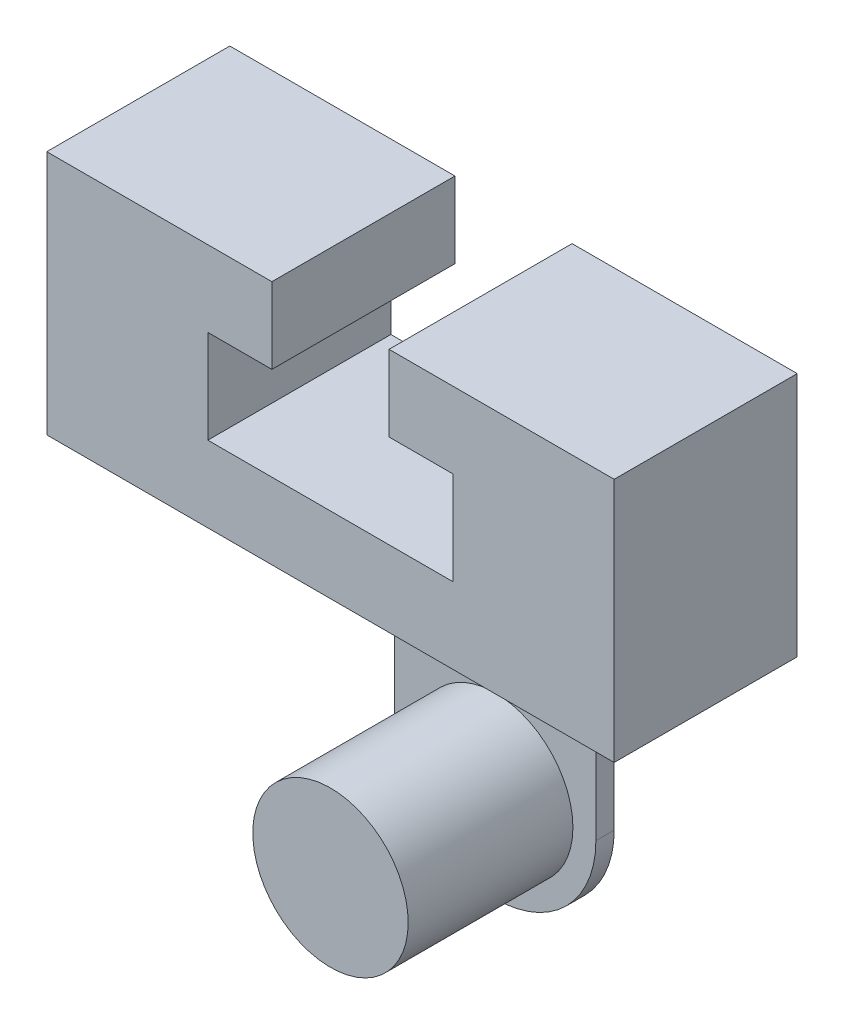
ISO-10303-21;
HEADER;
FILE_DESCRIPTION(('STEP AP214'),'2;1');
FILE_NAME('part.step','',(''),(''),'','','');
FILE_SCHEMA(('AUTOMOTIVE_DESIGN { 1 0 10303 214 1 1 1 1 }'));
ENDSEC;
DATA;
#1=APPLICATION_CONTEXT('core data for automotive mechanical design processes');
#2=APPLICATION_PROTOCOL_DEFINITION('international standard','automotive_design',2000,#1);
#3=PRODUCT_CONTEXT('',#1,'mechanical');
#4=PRODUCT('Part','Part','',(#3));
#5=PRODUCT_RELATED_PRODUCT_CATEGORY('part','',(#4));
#6=PRODUCT_DEFINITION_FORMATION('','',#4);
#7=PRODUCT_DEFINITION_CONTEXT('part definition',#1,'design');
#8=PRODUCT_DEFINITION('design','',#6,#7);
#9=PRODUCT_DEFINITION_SHAPE('','',#8);
#10=(LENGTH_UNIT() NAMED_UNIT(*) SI_UNIT(.MILLI.,.METRE.));
#11=(NAMED_UNIT(*) PLANE_ANGLE_UNIT() SI_UNIT($,.RADIAN.));
#12=(NAMED_UNIT(*) SI_UNIT($,.STERADIAN.) SOLID_ANGLE_UNIT());
#13=UNCERTAINTY_MEASURE_WITH_UNIT(LENGTH_MEASURE(1.E-05),#10,'distance_accuracy_value','');
#14=(GEOMETRIC_REPRESENTATION_CONTEXT(3) GLOBAL_UNCERTAINTY_ASSIGNED_CONTEXT((#13)) GLOBAL_UNIT_ASSIGNED_CONTEXT((#10,
#11,#12)) REPRESENTATION_CONTEXT('',''));
#15=CARTESIAN_POINT('',(0.,0.,0.));
#16=DIRECTION('',(0.,0.,1.));
#17=DIRECTION('',(1.,0.,0.));
#18=AXIS2_PLACEMENT_3D('',#15,#16,#17);
#19=CARTESIAN_POINT('',(53.34,-33.528,25.4));
#20=DIRECTION('',(-1.,0.,0.));
#21=DIRECTION('',(0.,0.,1.));
#22=AXIS2_PLACEMENT_3D('',#19,#20,#21);
#23=PLANE('',#22);
#24=DIRECTION('',(0.,1.,0.));
#25=VECTOR('',#24,1.);
#26=CARTESIAN_POINT('',(53.34,0.,2.54));
#27=LINE('',#26,#25);
#28=CARTESIAN_POINT('',(53.34,-33.528,2.54));
#29=VERTEX_POINT('',#28);
#30=CARTESIAN_POINT('',(53.34,0.,2.54));
#31=VERTEX_POINT('',#30);
#32=EDGE_CURVE('E187',#29,#31,#27,.T.);
#33=ORIENTED_EDGE('',*,*,#32,.F.);
#34=DIRECTION('',(0.,0.,-1.));
#35=VECTOR('',#34,1.);
#36=CARTESIAN_POINT('',(53.34,-33.528,25.4));
#37=LINE('',#36,#35);
#38=CARTESIAN_POINT('',(53.34,-33.528,0.));
#39=VERTEX_POINT('',#38);
#40=EDGE_CURVE('E12',#29,#39,#37,.T.);
#41=ORIENTED_EDGE('',*,*,#40,.T.);
#42=DIRECTION('',(0.,1.,0.));
#43=VECTOR('',#42,1.);
#44=CARTESIAN_POINT('',(53.34,-33.528,0.));
#45=LINE('',#44,#43);
#46=CARTESIAN_POINT('',(53.34,0.,0.));
#47=VERTEX_POINT('',#46);
#48=EDGE_CURVE('E227',#39,#47,#45,.T.);
#49=ORIENTED_EDGE('',*,*,#48,.T.);
#50=DIRECTION('',(0.,0.,-1.));
#51=VECTOR('',#50,1.);
#52=CARTESIAN_POINT('',(53.34,0.,25.4));
#53=LINE('',#52,#51);
#54=EDGE_CURVE('E62',#31,#47,#53,.T.);
#55=ORIENTED_EDGE('',*,*,#54,.F.);
#56=EDGE_LOOP('',(#33,#41,#49,#55));
#57=FACE_BOUND('',#56,.T.);
#58=ADVANCED_FACE('F55',(#57),#23,.F.);
#59=CARTESIAN_POINT('',(39.37,-33.528,25.4));
#60=DIRECTION('',(0.,0.,-1.));
#61=DIRECTION('',(-1.,0.,0.));
#62=AXIS2_PLACEMENT_3D('',#59,#60,#61);
#63=CYLINDRICAL_SURFACE('',#62,13.97);
#64=CARTESIAN_POINT('',(39.37,-33.528,2.54));
#65=DIRECTION('',(0.,0.,1.));
#66=DIRECTION('',(1.,0.,0.));
#67=AXIS2_PLACEMENT_3D('',#64,#65,#66);
#68=CIRCLE('',#67,13.97);
#69=CARTESIAN_POINT('',(25.4,-33.528,2.54));
#70=VERTEX_POINT('',#69);
#71=EDGE_CURVE('E174',#70,#29,#68,.T.);
#72=ORIENTED_EDGE('',*,*,#71,.F.);
#73=DIRECTION('',(0.,0.,-1.));
#74=VECTOR('',#73,1.);
#75=CARTESIAN_POINT('',(25.4,-33.528,25.4));
#76=LINE('',#75,#74);
#77=CARTESIAN_POINT('',(25.4,-33.528,0.));
#78=VERTEX_POINT('',#77);
#79=EDGE_CURVE('E109',#70,#78,#76,.T.);
#80=ORIENTED_EDGE('',*,*,#79,.T.);
#81=CARTESIAN_POINT('',(39.37,-33.528,0.));
#82=DIRECTION('',(0.,0.,1.));
#83=DIRECTION('',(1.,0.,0.));
#84=AXIS2_PLACEMENT_3D('',#81,#82,#83);
#85=CIRCLE('',#84,13.97);
#86=EDGE_CURVE('E229',#78,#39,#85,.T.);
#87=ORIENTED_EDGE('',*,*,#86,.T.);
#88=ORIENTED_EDGE('',*,*,#40,.F.);
#89=EDGE_LOOP('',(#72,#80,#87,#88));
#90=FACE_BOUND('',#89,.T.);
#91=ADVANCED_FACE('F53',(#90),#63,.T.);
#92=CARTESIAN_POINT('',(0.,34.036,25.4));
#93=DIRECTION('',(0.,1.,0.));
#94=DIRECTION('',(0.,0.,1.));
#95=AXIS2_PLACEMENT_3D('',#92,#93,#94);
#96=PLANE('',#95);
#97=DIRECTION('',(1.,0.,0.));
#98=VECTOR('',#97,1.);
#99=CARTESIAN_POINT('',(0.,34.036,0.));
#100=LINE('',#99,#98);
#101=CARTESIAN_POINT('',(47.498,34.036,0.));
#102=VERTEX_POINT('',#101);
#103=CARTESIAN_POINT('',(78.74,34.036,0.));
#104=VERTEX_POINT('',#103);
#105=EDGE_CURVE('E239',#102,#104,#100,.T.);
#106=ORIENTED_EDGE('',*,*,#105,.F.);
#107=DIRECTION('',(0.,0.,1.));
#108=VECTOR('',#107,1.);
#109=CARTESIAN_POINT('',(47.498,34.036,0.));
#110=LINE('',#109,#108);
#111=CARTESIAN_POINT('',(47.498,34.036,25.4));
#112=VERTEX_POINT('',#111);
#113=EDGE_CURVE('E307',#102,#112,#110,.T.);
#114=ORIENTED_EDGE('',*,*,#113,.T.);
#115=DIRECTION('',(1.,0.,0.));
#116=VECTOR('',#115,1.);
#117=CARTESIAN_POINT('',(0.,34.036,25.4));
#118=LINE('',#117,#116);
#119=CARTESIAN_POINT('',(78.74,34.036,25.4));
#120=VERTEX_POINT('',#119);
#121=EDGE_CURVE('E256',#112,#120,#118,.T.);
#122=ORIENTED_EDGE('',*,*,#121,.T.);
#123=DIRECTION('',(0.,0.,-1.));
#124=VECTOR('',#123,1.);
#125=CARTESIAN_POINT('',(78.74,34.036,25.4));
#126=LINE('',#125,#124);
#127=EDGE_CURVE('E212',#120,#104,#126,.T.);
#128=ORIENTED_EDGE('',*,*,#127,.T.);
#129=EDGE_LOOP('',(#106,#114,#122,#128));
#130=FACE_BOUND('',#129,.T.);
#131=ADVANCED_FACE('F403',(#130),#96,.T.);
#132=CARTESIAN_POINT('',(78.74,0.,25.4));
#133=DIRECTION('',(-1.,0.,0.));
#134=DIRECTION('',(0.,0.,1.));
#135=AXIS2_PLACEMENT_3D('',#132,#133,#134);
#136=PLANE('',#135);
#137=DIRECTION('',(0.,1.,0.));
#138=VECTOR('',#137,1.);
#139=CARTESIAN_POINT('',(78.74,0.,0.));
#140=LINE('',#139,#138);
#141=CARTESIAN_POINT('',(78.74,0.,0.));
#142=VERTEX_POINT('',#141);
#143=EDGE_CURVE('E236',#142,#104,#140,.T.);
#144=ORIENTED_EDGE('',*,*,#143,.T.);
#145=ORIENTED_EDGE('',*,*,#127,.F.);
#146=DIRECTION('',(0.,1.,0.));
#147=VECTOR('',#146,1.);
#148=CARTESIAN_POINT('',(78.74,0.,25.4));
#149=LINE('',#148,#147);
#150=CARTESIAN_POINT('',(78.74,0.,25.4));
#151=VERTEX_POINT('',#150);
#152=EDGE_CURVE('E257',#151,#120,#149,.T.);
#153=ORIENTED_EDGE('',*,*,#152,.F.);
#154=DIRECTION('',(0.,0.,-1.));
#155=VECTOR('',#154,1.);
#156=CARTESIAN_POINT('',(78.74,0.,25.4));
#157=LINE('',#156,#155);
#158=EDGE_CURVE('E213',#151,#142,#157,.T.);
#159=ORIENTED_EDGE('',*,*,#158,.T.);
#160=EDGE_LOOP('',(#144,#145,#153,#159));
#161=FACE_BOUND('',#160,.T.);
#162=ADVANCED_FACE('F406',(#161),#136,.F.);
#163=DIRECTION('',(0.,0.,1.));
#164=VECTOR('',#163,1.);
#165=CARTESIAN_POINT('',(31.242,34.036,0.));
#166=LINE('',#165,#164);
#167=CARTESIAN_POINT('',(31.242,34.036,0.));
#168=VERTEX_POINT('',#167);
#169=CARTESIAN_POINT('',(31.242,34.036,25.4));
#170=VERTEX_POINT('',#169);
#171=EDGE_CURVE('E306',#168,#170,#166,.T.);
#172=ORIENTED_EDGE('',*,*,#171,.F.);
#173=CARTESIAN_POINT('',(0.,34.036,0.));
#174=VERTEX_POINT('',#173);
#175=EDGE_CURVE('E242',#174,#168,#100,.T.);
#176=ORIENTED_EDGE('',*,*,#175,.F.);
#177=DIRECTION('',(0.,0.,-1.));
#178=VECTOR('',#177,1.);
#179=CARTESIAN_POINT('',(0.,34.036,25.4));
#180=LINE('',#179,#178);
#181=CARTESIAN_POINT('',(0.,34.036,25.4));
#182=VERTEX_POINT('',#181);
#183=EDGE_CURVE('E206',#182,#174,#180,.T.);
#184=ORIENTED_EDGE('',*,*,#183,.F.);
#185=EDGE_CURVE('E202',#182,#170,#118,.T.);
#186=ORIENTED_EDGE('',*,*,#185,.T.);
#187=EDGE_LOOP('',(#172,#176,#184,#186));
#188=FACE_BOUND('',#187,.T.);
#189=ADVANCED_FACE('F399',(#188),#96,.T.);
#190=CARTESIAN_POINT('',(0.,0.,25.4));
#191=DIRECTION('',(-1.,0.,0.));
#192=DIRECTION('',(0.,0.,1.));
#193=AXIS2_PLACEMENT_3D('',#190,#191,#192);
#194=PLANE('',#193);
#195=DIRECTION('',(0.,1.,0.));
#196=VECTOR('',#195,1.);
#197=CARTESIAN_POINT('',(0.,0.,0.));
#198=LINE('',#197,#196);
#199=CARTESIAN_POINT('',(0.,0.,0.));
#200=VERTEX_POINT('',#199);
#201=EDGE_CURVE('E247',#200,#174,#198,.T.);
#202=ORIENTED_EDGE('',*,*,#201,.F.);
#203=DIRECTION('',(0.,0.,-1.));
#204=VECTOR('',#203,1.);
#205=CARTESIAN_POINT('',(0.,0.,25.4));
#206=LINE('',#205,#204);
#207=CARTESIAN_POINT('',(0.,0.,25.4));
#208=VERTEX_POINT('',#207);
#209=EDGE_CURVE('E200',#208,#200,#206,.T.);
#210=ORIENTED_EDGE('',*,*,#209,.F.);
#211=DIRECTION('',(0.,1.,0.));
#212=VECTOR('',#211,1.);
#213=CARTESIAN_POINT('',(0.,0.,25.4));
#214=LINE('',#213,#212);
#215=EDGE_CURVE('E191',#208,#182,#214,.T.);
#216=ORIENTED_EDGE('',*,*,#215,.T.);
#217=ORIENTED_EDGE('',*,*,#183,.T.);
#218=EDGE_LOOP('',(#202,#210,#216,#217));
#219=FACE_BOUND('',#218,.T.);
#220=ADVANCED_FACE('F417',(#219),#194,.T.);
#221=CARTESIAN_POINT('',(0.,0.,25.4));
#222=DIRECTION('',(0.,1.,0.));
#223=DIRECTION('',(0.,0.,1.));
#224=AXIS2_PLACEMENT_3D('',#221,#222,#223);
#225=PLANE('',#224);
#226=DIRECTION('',(1.,0.,0.));
#227=VECTOR('',#226,1.);
#228=CARTESIAN_POINT('',(0.,0.,0.));
#229=LINE('',#228,#227);
#230=CARTESIAN_POINT('',(25.4,0.,0.));
#231=VERTEX_POINT('',#230);
#232=EDGE_CURVE('E252',#200,#231,#229,.T.);
#233=ORIENTED_EDGE('',*,*,#232,.T.);
#234=DIRECTION('',(0.,0.,-1.));
#235=VECTOR('',#234,1.);
#236=CARTESIAN_POINT('',(25.4,0.,25.4));
#237=LINE('',#236,#235);
#238=CARTESIAN_POINT('',(25.4,0.,2.54));
#239=VERTEX_POINT('',#238);
#240=EDGE_CURVE('E194',#239,#231,#237,.T.);
#241=ORIENTED_EDGE('',*,*,#240,.F.);
#242=DIRECTION('',(-1.,0.,0.));
#243=VECTOR('',#242,1.);
#244=CARTESIAN_POINT('',(25.4,0.,2.54));
#245=LINE('',#244,#243);
#246=EDGE_CURVE('E178',#31,#239,#245,.T.);
#247=ORIENTED_EDGE('',*,*,#246,.F.);
#248=ORIENTED_EDGE('',*,*,#54,.T.);
#249=DIRECTION('',(1.,0.,0.));
#250=VECTOR('',#249,1.);
#251=CARTESIAN_POINT('',(53.34,0.,0.));
#252=LINE('',#251,#250);
#253=EDGE_CURVE('E221',#47,#142,#252,.T.);
#254=ORIENTED_EDGE('',*,*,#253,.T.);
#255=ORIENTED_EDGE('',*,*,#158,.F.);
#256=DIRECTION('',(1.,0.,0.));
#257=VECTOR('',#256,1.);
#258=CARTESIAN_POINT('',(53.34,0.,25.4));
#259=LINE('',#258,#257);
#260=EDGE_CURVE('E80',#208,#151,#259,.T.);
#261=ORIENTED_EDGE('',*,*,#260,.F.);
#262=ORIENTED_EDGE('',*,*,#209,.T.);
#263=EDGE_LOOP('',(#233,#241,#247,#248,#254,#255,#261,#262));
#264=FACE_BOUND('',#263,.T.);
#265=ADVANCED_FACE('F225',(#264),#225,.F.);
#266=CARTESIAN_POINT('',(25.4,-33.528,25.4));
#267=DIRECTION('',(-1.,0.,0.));
#268=DIRECTION('',(0.,0.,1.));
#269=AXIS2_PLACEMENT_3D('',#266,#267,#268);
#270=PLANE('',#269);
#271=DIRECTION('',(0.,-1.,0.));
#272=VECTOR('',#271,1.);
#273=CARTESIAN_POINT('',(25.4,0.,2.54));
#274=LINE('',#273,#272);
#275=EDGE_CURVE('E173',#239,#70,#274,.T.);
#276=ORIENTED_EDGE('',*,*,#275,.F.);
#277=ORIENTED_EDGE('',*,*,#240,.T.);
#278=DIRECTION('',(0.,1.,0.));
#279=VECTOR('',#278,1.);
#280=CARTESIAN_POINT('',(25.4,-33.528,0.));
#281=LINE('',#280,#279);
#282=EDGE_CURVE('E192',#78,#231,#281,.T.);
#283=ORIENTED_EDGE('',*,*,#282,.F.);
#284=ORIENTED_EDGE('',*,*,#79,.F.);
#285=EDGE_LOOP('',(#276,#277,#283,#284));
#286=FACE_BOUND('',#285,.T.);
#287=ADVANCED_FACE('F186',(#286),#270,.T.);
#288=CARTESIAN_POINT('',(39.37,-33.528,25.4));
#289=DIRECTION('',(0.,0.,1.));
#290=DIRECTION('',(1.,0.,0.));
#291=AXIS2_PLACEMENT_3D('',#288,#289,#290);
#292=PLANE('',#291);
#293=ORIENTED_EDGE('',*,*,#215,.F.);
#294=ORIENTED_EDGE('',*,*,#260,.T.);
#295=ORIENTED_EDGE('',*,*,#152,.T.);
#296=ORIENTED_EDGE('',*,*,#121,.F.);
#297=DIRECTION('',(0.,1.,0.));
#298=VECTOR('',#297,1.);
#299=CARTESIAN_POINT('',(47.498,23.495,25.4));
#300=LINE('',#299,#298);
#301=CARTESIAN_POINT('',(47.498,23.495,25.4));
#302=VERTEX_POINT('',#301);
#303=EDGE_CURVE('E336',#302,#112,#300,.T.);
#304=ORIENTED_EDGE('',*,*,#303,.F.);
#305=DIRECTION('',(-1.,0.,0.));
#306=VECTOR('',#305,1.);
#307=CARTESIAN_POINT('',(47.498,23.495,25.4));
#308=LINE('',#307,#306);
#309=CARTESIAN_POINT('',(56.388,23.495,25.4));
#310=VERTEX_POINT('',#309);
#311=EDGE_CURVE('E333',#310,#302,#308,.T.);
#312=ORIENTED_EDGE('',*,*,#311,.F.);
#313=DIRECTION('',(0.,1.,0.));
#314=VECTOR('',#313,1.);
#315=CARTESIAN_POINT('',(56.388,10.541,25.4));
#316=LINE('',#315,#314);
#317=CARTESIAN_POINT('',(56.388,10.541,25.4));
#318=VERTEX_POINT('',#317);
#319=EDGE_CURVE('E335',#318,#310,#316,.T.);
#320=ORIENTED_EDGE('',*,*,#319,.F.);
#321=DIRECTION('',(1.,0.,0.));
#322=VECTOR('',#321,1.);
#323=CARTESIAN_POINT('',(22.352,10.541,25.4));
#324=LINE('',#323,#322);
#325=CARTESIAN_POINT('',(22.352,10.541,25.4));
#326=VERTEX_POINT('',#325);
#327=EDGE_CURVE('E355',#326,#318,#324,.T.);
#328=ORIENTED_EDGE('',*,*,#327,.F.);
#329=DIRECTION('',(0.,-1.,0.));
#330=VECTOR('',#329,1.);
#331=CARTESIAN_POINT('',(22.352,10.541,25.4));
#332=LINE('',#331,#330);
#333=CARTESIAN_POINT('',(22.352,23.495,25.4));
#334=VERTEX_POINT('',#333);
#335=EDGE_CURVE('E348',#334,#326,#332,.T.);
#336=ORIENTED_EDGE('',*,*,#335,.F.);
#337=DIRECTION('',(-1.,0.,0.));
#338=VECTOR('',#337,1.);
#339=CARTESIAN_POINT('',(22.352,23.495,25.4));
#340=LINE('',#339,#338);
#341=CARTESIAN_POINT('',(31.242,23.495,25.4));
#342=VERTEX_POINT('',#341);
#343=EDGE_CURVE('E343',#342,#334,#340,.T.);
#344=ORIENTED_EDGE('',*,*,#343,.F.);
#345=DIRECTION('',(0.,-1.,0.));
#346=VECTOR('',#345,1.);
#347=CARTESIAN_POINT('',(31.242,23.495,25.4));
#348=LINE('',#347,#346);
#349=EDGE_CURVE('E342',#170,#342,#348,.T.);
#350=ORIENTED_EDGE('',*,*,#349,.F.);
#351=ORIENTED_EDGE('',*,*,#185,.F.);
#352=EDGE_LOOP('',(#293,#294,#295,#296,#304,#312,#320,#328,#336,#344,#350,#351));
#353=FACE_BOUND('',#352,.T.);
#354=ADVANCED_FACE('F369',(#353),#292,.T.);
#355=CARTESIAN_POINT('',(39.37,-33.528,0.));
#356=DIRECTION('',(0.,0.,1.));
#357=DIRECTION('',(1.,0.,0.));
#358=AXIS2_PLACEMENT_3D('',#355,#356,#357);
#359=PLANE('',#358);
#360=DIRECTION('',(-1.,0.,0.));
#361=VECTOR('',#360,1.);
#362=CARTESIAN_POINT('',(47.498,23.495,0.));
#363=LINE('',#362,#361);
#364=CARTESIAN_POINT('',(56.388,23.495,0.));
#365=VERTEX_POINT('',#364);
#366=CARTESIAN_POINT('',(47.498,23.495,0.));
#367=VERTEX_POINT('',#366);
#368=EDGE_CURVE('E372',#365,#367,#363,.T.);
#369=ORIENTED_EDGE('',*,*,#368,.T.);
#370=DIRECTION('',(0.,1.,0.));
#371=VECTOR('',#370,1.);
#372=CARTESIAN_POINT('',(47.498,23.495,0.));
#373=LINE('',#372,#371);
#374=EDGE_CURVE('E70',#367,#102,#373,.T.);
#375=ORIENTED_EDGE('',*,*,#374,.T.);
#376=ORIENTED_EDGE('',*,*,#105,.T.);
#377=ORIENTED_EDGE('',*,*,#143,.F.);
#378=ORIENTED_EDGE('',*,*,#253,.F.);
#379=ORIENTED_EDGE('',*,*,#48,.F.);
#380=ORIENTED_EDGE('',*,*,#86,.F.);
#381=ORIENTED_EDGE('',*,*,#282,.T.);
#382=ORIENTED_EDGE('',*,*,#232,.F.);
#383=ORIENTED_EDGE('',*,*,#201,.T.);
#384=ORIENTED_EDGE('',*,*,#175,.T.);
#385=DIRECTION('',(0.,-1.,0.));
#386=VECTOR('',#385,1.);
#387=CARTESIAN_POINT('',(31.242,23.495,0.));
#388=LINE('',#387,#386);
#389=CARTESIAN_POINT('',(31.242,23.495,0.));
#390=VERTEX_POINT('',#389);
#391=EDGE_CURVE('E381',#168,#390,#388,.T.);
#392=ORIENTED_EDGE('',*,*,#391,.T.);
#393=DIRECTION('',(-1.,0.,0.));
#394=VECTOR('',#393,1.);
#395=CARTESIAN_POINT('',(22.352,23.495,0.));
#396=LINE('',#395,#394);
#397=CARTESIAN_POINT('',(22.352,23.495,0.));
#398=VERTEX_POINT('',#397);
#399=EDGE_CURVE('E330',#390,#398,#396,.T.);
#400=ORIENTED_EDGE('',*,*,#399,.T.);
#401=DIRECTION('',(0.,-1.,0.));
#402=VECTOR('',#401,1.);
#403=CARTESIAN_POINT('',(22.352,10.541,0.));
#404=LINE('',#403,#402);
#405=CARTESIAN_POINT('',(22.352,10.541,0.));
#406=VERTEX_POINT('',#405);
#407=EDGE_CURVE('E325',#398,#406,#404,.T.);
#408=ORIENTED_EDGE('',*,*,#407,.T.);
#409=DIRECTION('',(1.,0.,0.));
#410=VECTOR('',#409,1.);
#411=CARTESIAN_POINT('',(22.352,10.541,0.));
#412=LINE('',#411,#410);
#413=CARTESIAN_POINT('',(56.388,10.541,0.));
#414=VERTEX_POINT('',#413);
#415=EDGE_CURVE('E317',#406,#414,#412,.T.);
#416=ORIENTED_EDGE('',*,*,#415,.T.);
#417=DIRECTION('',(0.,1.,0.));
#418=VECTOR('',#417,1.);
#419=CARTESIAN_POINT('',(56.388,10.541,0.));
#420=LINE('',#419,#418);
#421=EDGE_CURVE('E358',#414,#365,#420,.T.);
#422=ORIENTED_EDGE('',*,*,#421,.T.);
#423=EDGE_LOOP('',(#369,#375,#376,#377,#378,#379,#380,#381,#382,#383,#384,#392,#400,#408,#416,#422));
#424=FACE_BOUND('',#423,.T.);
#425=ADVANCED_FACE('F234',(#424),#359,.F.);
#426=CARTESIAN_POINT('',(56.388,10.541,0.));
#427=DIRECTION('',(1.,0.,0.));
#428=DIRECTION('',(0.,0.,-1.));
#429=AXIS2_PLACEMENT_3D('',#426,#427,#428);
#430=PLANE('',#429);
#431=ORIENTED_EDGE('',*,*,#319,.T.);
#432=DIRECTION('',(0.,0.,1.));
#433=VECTOR('',#432,1.);
#434=CARTESIAN_POINT('',(56.388,23.495,0.));
#435=LINE('',#434,#433);
#436=EDGE_CURVE('E265',#365,#310,#435,.T.);
#437=ORIENTED_EDGE('',*,*,#436,.F.);
#438=ORIENTED_EDGE('',*,*,#421,.F.);
#439=DIRECTION('',(0.,0.,1.));
#440=VECTOR('',#439,1.);
#441=CARTESIAN_POINT('',(56.388,10.541,0.));
#442=LINE('',#441,#440);
#443=EDGE_CURVE('E289',#414,#318,#442,.T.);
#444=ORIENTED_EDGE('',*,*,#443,.T.);
#445=EDGE_LOOP('',(#431,#437,#438,#444));
#446=FACE_BOUND('',#445,.T.);
#447=ADVANCED_FACE('F373',(#446),#430,.F.);
#448=CARTESIAN_POINT('',(22.352,10.541,0.));
#449=DIRECTION('',(0.,-1.,0.));
#450=DIRECTION('',(0.,0.,-1.));
#451=AXIS2_PLACEMENT_3D('',#448,#449,#450);
#452=PLANE('',#451);
#453=ORIENTED_EDGE('',*,*,#327,.T.);
#454=ORIENTED_EDGE('',*,*,#443,.F.);
#455=ORIENTED_EDGE('',*,*,#415,.F.);
#456=DIRECTION('',(0.,0.,1.));
#457=VECTOR('',#456,1.);
#458=CARTESIAN_POINT('',(22.352,10.541,0.));
#459=LINE('',#458,#457);
#460=EDGE_CURVE('E297',#406,#326,#459,.T.);
#461=ORIENTED_EDGE('',*,*,#460,.T.);
#462=EDGE_LOOP('',(#453,#454,#455,#461));
#463=FACE_BOUND('',#462,.T.);
#464=ADVANCED_FACE('F365',(#463),#452,.F.);
#465=CARTESIAN_POINT('',(22.352,10.541,0.));
#466=DIRECTION('',(-1.,0.,0.));
#467=DIRECTION('',(0.,0.,1.));
#468=AXIS2_PLACEMENT_3D('',#465,#466,#467);
#469=PLANE('',#468);
#470=ORIENTED_EDGE('',*,*,#335,.T.);
#471=ORIENTED_EDGE('',*,*,#460,.F.);
#472=ORIENTED_EDGE('',*,*,#407,.F.);
#473=DIRECTION('',(0.,0.,1.));
#474=VECTOR('',#473,1.);
#475=CARTESIAN_POINT('',(22.352,23.495,0.));
#476=LINE('',#475,#474);
#477=EDGE_CURVE('E298',#398,#334,#476,.T.);
#478=ORIENTED_EDGE('',*,*,#477,.T.);
#479=EDGE_LOOP('',(#470,#471,#472,#478));
#480=FACE_BOUND('',#479,.T.);
#481=ADVANCED_FACE('F368',(#480),#469,.F.);
#482=CARTESIAN_POINT('',(22.352,23.495,0.));
#483=DIRECTION('',(0.,1.,0.));
#484=DIRECTION('',(-1.,0.,0.));
#485=AXIS2_PLACEMENT_3D('',#482,#483,#484);
#486=PLANE('',#485);
#487=ORIENTED_EDGE('',*,*,#343,.T.);
#488=ORIENTED_EDGE('',*,*,#477,.F.);
#489=ORIENTED_EDGE('',*,*,#399,.F.);
#490=DIRECTION('',(0.,0.,1.));
#491=VECTOR('',#490,1.);
#492=CARTESIAN_POINT('',(31.242,23.495,0.));
#493=LINE('',#492,#491);
#494=EDGE_CURVE('E301',#390,#342,#493,.T.);
#495=ORIENTED_EDGE('',*,*,#494,.T.);
#496=EDGE_LOOP('',(#487,#488,#489,#495));
#497=FACE_BOUND('',#496,.T.);
#498=ADVANCED_FACE('F394',(#497),#486,.F.);
#499=CARTESIAN_POINT('',(31.242,23.495,0.));
#500=DIRECTION('',(-1.,0.,0.));
#501=DIRECTION('',(0.,0.,1.));
#502=AXIS2_PLACEMENT_3D('',#499,#500,#501);
#503=PLANE('',#502);
#504=ORIENTED_EDGE('',*,*,#349,.T.);
#505=ORIENTED_EDGE('',*,*,#494,.F.);
#506=ORIENTED_EDGE('',*,*,#391,.F.);
#507=ORIENTED_EDGE('',*,*,#171,.T.);
#508=EDGE_LOOP('',(#504,#505,#506,#507));
#509=FACE_BOUND('',#508,.T.);
#510=ADVANCED_FACE('F524',(#509),#503,.F.);
#511=CARTESIAN_POINT('',(47.498,23.495,0.));
#512=DIRECTION('',(1.,0.,0.));
#513=DIRECTION('',(0.,0.,-1.));
#514=AXIS2_PLACEMENT_3D('',#511,#512,#513);
#515=PLANE('',#514);
#516=ORIENTED_EDGE('',*,*,#303,.T.);
#517=ORIENTED_EDGE('',*,*,#113,.F.);
#518=ORIENTED_EDGE('',*,*,#374,.F.);
#519=DIRECTION('',(0.,0.,1.));
#520=VECTOR('',#519,1.);
#521=CARTESIAN_POINT('',(47.498,23.495,0.));
#522=LINE('',#521,#520);
#523=EDGE_CURVE('E315',#367,#302,#522,.T.);
#524=ORIENTED_EDGE('',*,*,#523,.T.);
#525=EDGE_LOOP('',(#516,#517,#518,#524));
#526=FACE_BOUND('',#525,.T.);
#527=ADVANCED_FACE('F528',(#526),#515,.F.);
#528=CARTESIAN_POINT('',(47.498,23.495,0.));
#529=DIRECTION('',(0.,1.,0.));
#530=DIRECTION('',(-1.,0.,0.));
#531=AXIS2_PLACEMENT_3D('',#528,#529,#530);
#532=PLANE('',#531);
#533=ORIENTED_EDGE('',*,*,#311,.T.);
#534=ORIENTED_EDGE('',*,*,#523,.F.);
#535=ORIENTED_EDGE('',*,*,#368,.F.);
#536=ORIENTED_EDGE('',*,*,#436,.T.);
#537=EDGE_LOOP('',(#533,#534,#535,#536));
#538=FACE_BOUND('',#537,.T.);
#539=ADVANCED_FACE('F374',(#538),#532,.F.);
#540=CARTESIAN_POINT('',(39.37,-33.528,2.54));
#541=DIRECTION('',(0.,0.,1.));
#542=DIRECTION('',(1.,0.,0.));
#543=AXIS2_PLACEMENT_3D('',#540,#541,#542);
#544=PLANE('',#543);
#545=CARTESIAN_POINT('',(39.37,-33.528,2.54));
#546=DIRECTION('',(0.,0.,1.));
#547=DIRECTION('',(1.,0.,0.));
#548=AXIS2_PLACEMENT_3D('',#545,#546,#547);
#549=CIRCLE('',#548,10.7823);
#550=CARTESIAN_POINT('',(50.1523,-33.528,2.54));
#551=VERTEX_POINT('',#550);
#552=EDGE_CURVE('E271',#551,#551,#549,.T.);
#553=ORIENTED_EDGE('',*,*,#552,.F.);
#554=EDGE_LOOP('',(#553));
#555=FACE_BOUND('',#554,.T.);
#556=ORIENTED_EDGE('',*,*,#275,.T.);
#557=ORIENTED_EDGE('',*,*,#71,.T.);
#558=ORIENTED_EDGE('',*,*,#32,.T.);
#559=ORIENTED_EDGE('',*,*,#246,.T.);
#560=EDGE_LOOP('',(#556,#557,#558,#559));
#561=FACE_BOUND('',#560,.T.);
#562=ADVANCED_FACE('F172',(#555,#561),#544,.T.);
#563=CARTESIAN_POINT('',(39.37,-33.528,25.4));
#564=DIRECTION('',(0.,0.,-1.));
#565=DIRECTION('',(-1.,0.,0.));
#566=AXIS2_PLACEMENT_3D('',#563,#564,#565);
#567=CYLINDRICAL_SURFACE('',#566,10.7823);
#568=CARTESIAN_POINT('',(39.37,-33.528,25.4));
#569=DIRECTION('',(0.,0.,1.));
#570=DIRECTION('',(1.,0.,0.));
#571=AXIS2_PLACEMENT_3D('',#568,#569,#570);
#572=CIRCLE('',#571,10.7823);
#573=CARTESIAN_POINT('',(50.1523,-33.528,25.4));
#574=VERTEX_POINT('',#573);
#575=EDGE_CURVE('E185',#574,#574,#572,.T.);
#576=ORIENTED_EDGE('',*,*,#575,.F.);
#577=EDGE_LOOP('',(#576));
#578=FACE_BOUND('',#577,.T.);
#579=ORIENTED_EDGE('',*,*,#552,.T.);
#580=EDGE_LOOP('',(#579));
#581=FACE_BOUND('',#580,.T.);
#582=ADVANCED_FACE('F435',(#578,#581),#567,.T.);
#583=CARTESIAN_POINT('',(39.37,-33.528,25.4));
#584=DIRECTION('',(0.,0.,1.));
#585=DIRECTION('',(1.,0.,0.));
#586=AXIS2_PLACEMENT_3D('',#583,#584,#585);
#587=PLANE('',#586);
#588=ORIENTED_EDGE('',*,*,#575,.T.);
#589=EDGE_LOOP('',(#588));
#590=FACE_BOUND('',#589,.T.);
#591=ADVANCED_FACE('F446',(#590),#587,.T.);
#592=CLOSED_SHELL('',(#58,#91,#131,#162,#189,#220,#265,#287,#354,#425,#447,#464,#481,#498,#510,
#527,#539,#562,#582,#591));
#593=MANIFOLD_SOLID_BREP('B2',#592);
#594=ADVANCED_BREP_SHAPE_REPRESENTATION('',(#18,#593),#14);
#595=SHAPE_DEFINITION_REPRESENTATION(#9,#594);
ENDSEC;
END-ISO-10303-21;
